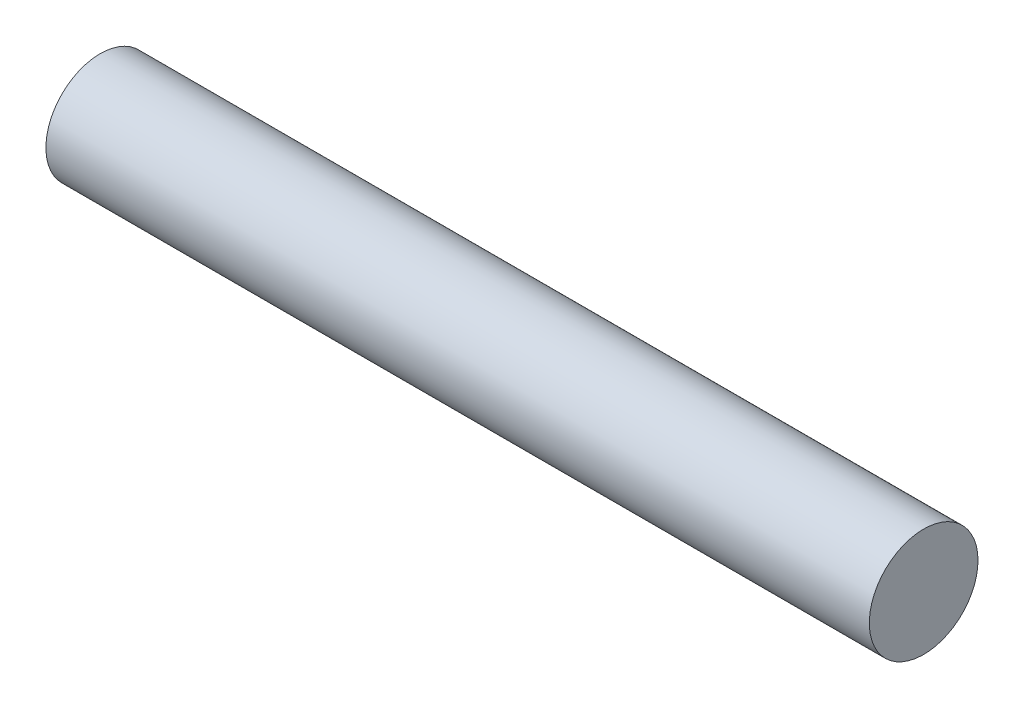
ISO-10303-21;
HEADER;
FILE_DESCRIPTION(('STEP AP214'),'2;1');
FILE_NAME('part.step','',(''),(''),'','','');
FILE_SCHEMA(('AUTOMOTIVE_DESIGN { 1 0 10303 214 1 1 1 1 }'));
ENDSEC;
DATA;
#1=APPLICATION_CONTEXT('core data for automotive mechanical design processes');
#2=APPLICATION_PROTOCOL_DEFINITION('international standard','automotive_design',2000,#1);
#3=PRODUCT_CONTEXT('',#1,'mechanical');
#4=PRODUCT('Part','Part','',(#3));
#5=PRODUCT_RELATED_PRODUCT_CATEGORY('part','',(#4));
#6=PRODUCT_DEFINITION_FORMATION('','',#4);
#7=PRODUCT_DEFINITION_CONTEXT('part definition',#1,'design');
#8=PRODUCT_DEFINITION('design','',#6,#7);
#9=PRODUCT_DEFINITION_SHAPE('','',#8);
#10=(LENGTH_UNIT() NAMED_UNIT(*) SI_UNIT(.MILLI.,.METRE.));
#11=(NAMED_UNIT(*) PLANE_ANGLE_UNIT() SI_UNIT($,.RADIAN.));
#12=(NAMED_UNIT(*) SI_UNIT($,.STERADIAN.) SOLID_ANGLE_UNIT());
#13=UNCERTAINTY_MEASURE_WITH_UNIT(LENGTH_MEASURE(1.E-05),#10,'distance_accuracy_value','');
#14=(GEOMETRIC_REPRESENTATION_CONTEXT(3) GLOBAL_UNCERTAINTY_ASSIGNED_CONTEXT((#13)) GLOBAL_UNIT_ASSIGNED_CONTEXT((#10,
#11,#12)) REPRESENTATION_CONTEXT('',''));
#15=CARTESIAN_POINT('',(0.,0.,0.));
#16=DIRECTION('',(0.,0.,1.));
#17=DIRECTION('',(1.,0.,0.));
#18=AXIS2_PLACEMENT_3D('',#15,#16,#17);
#19=CARTESIAN_POINT('',(381.,0.,0.));
#20=DIRECTION('',(-1.,0.,0.));
#21=DIRECTION('',(0.,0.,1.));
#22=AXIS2_PLACEMENT_3D('',#19,#20,#21);
#23=CYLINDRICAL_SURFACE('',#22,25.146);
#24=CARTESIAN_POINT('',(381.,0.,0.));
#25=DIRECTION('',(1.,0.,0.));
#26=DIRECTION('',(0.,0.,-1.));
#27=AXIS2_PLACEMENT_3D('',#24,#25,#26);
#28=CIRCLE('',#27,25.146);
#29=CARTESIAN_POINT('',(381.,0.,-25.146));
#30=VERTEX_POINT('',#29);
#31=EDGE_CURVE('E10',#30,#30,#28,.T.);
#32=ORIENTED_EDGE('',*,*,#31,.F.);
#33=EDGE_LOOP('',(#32));
#34=FACE_BOUND('',#33,.T.);
#35=CARTESIAN_POINT('',(0.,0.,0.));
#36=DIRECTION('',(1.,0.,0.));
#37=DIRECTION('',(0.,0.,-1.));
#38=AXIS2_PLACEMENT_3D('',#35,#36,#37);
#39=CIRCLE('',#38,25.146);
#40=CARTESIAN_POINT('',(0.,0.,-25.146));
#41=VERTEX_POINT('',#40);
#42=EDGE_CURVE('E46',#41,#41,#39,.T.);
#43=ORIENTED_EDGE('',*,*,#42,.T.);
#44=EDGE_LOOP('',(#43));
#45=FACE_BOUND('',#44,.T.);
#46=ADVANCED_FACE('F43',(#34,#45),#23,.T.);
#47=CARTESIAN_POINT('',(381.,0.,0.));
#48=DIRECTION('',(1.,0.,0.));
#49=DIRECTION('',(0.,0.,-1.));
#50=AXIS2_PLACEMENT_3D('',#47,#48,#49);
#51=PLANE('',#50);
#52=ORIENTED_EDGE('',*,*,#31,.T.);
#53=EDGE_LOOP('',(#52));
#54=FACE_BOUND('',#53,.T.);
#55=ADVANCED_FACE('F60',(#54),#51,.T.);
#56=CARTESIAN_POINT('',(0.,0.,0.));
#57=DIRECTION('',(1.,0.,0.));
#58=DIRECTION('',(0.,0.,-1.));
#59=AXIS2_PLACEMENT_3D('',#56,#57,#58);
#60=PLANE('',#59);
#61=ORIENTED_EDGE('',*,*,#42,.F.);
#62=EDGE_LOOP('',(#61));
#63=FACE_BOUND('',#62,.T.);
#64=ADVANCED_FACE('F58',(#63),#60,.F.);
#65=CLOSED_SHELL('',(#46,#55,#64));
#66=MANIFOLD_SOLID_BREP('B2',#65);
#67=ADVANCED_BREP_SHAPE_REPRESENTATION('',(#18,#66),#14);
#68=SHAPE_DEFINITION_REPRESENTATION(#9,#67);
ENDSEC;
END-ISO-10303-21;
